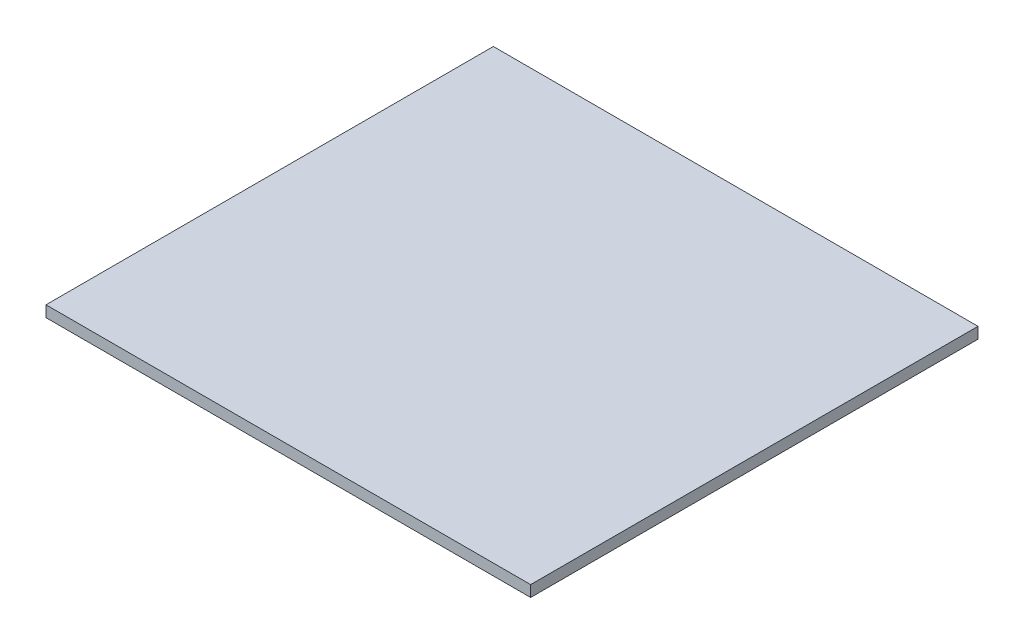
ISO-10303-21;
HEADER;
FILE_DESCRIPTION(('STEP AP214'),'2;1');
FILE_NAME('part.step','',(''),(''),'','','');
FILE_SCHEMA(('AUTOMOTIVE_DESIGN { 1 0 10303 214 1 1 1 1 }'));
ENDSEC;
DATA;
#1=APPLICATION_CONTEXT('core data for automotive mechanical design processes');
#2=APPLICATION_PROTOCOL_DEFINITION('international standard','automotive_design',2000,#1);
#3=PRODUCT_CONTEXT('',#1,'mechanical');
#4=PRODUCT('Part','Part','',(#3));
#5=PRODUCT_RELATED_PRODUCT_CATEGORY('part','',(#4));
#6=PRODUCT_DEFINITION_FORMATION('','',#4);
#7=PRODUCT_DEFINITION_CONTEXT('part definition',#1,'design');
#8=PRODUCT_DEFINITION('design','',#6,#7);
#9=PRODUCT_DEFINITION_SHAPE('','',#8);
#10=(LENGTH_UNIT() NAMED_UNIT(*) SI_UNIT(.MILLI.,.METRE.));
#11=(NAMED_UNIT(*) PLANE_ANGLE_UNIT() SI_UNIT($,.RADIAN.));
#12=(NAMED_UNIT(*) SI_UNIT($,.STERADIAN.) SOLID_ANGLE_UNIT());
#13=UNCERTAINTY_MEASURE_WITH_UNIT(LENGTH_MEASURE(1.E-05),#10,'distance_accuracy_value','');
#14=(GEOMETRIC_REPRESENTATION_CONTEXT(3) GLOBAL_UNCERTAINTY_ASSIGNED_CONTEXT((#13)) GLOBAL_UNIT_ASSIGNED_CONTEXT((#10,
#11,#12)) REPRESENTATION_CONTEXT('',''));
#15=CARTESIAN_POINT('',(0.,0.,0.));
#16=DIRECTION('',(0.,0.,1.));
#17=DIRECTION('',(1.,0.,0.));
#18=AXIS2_PLACEMENT_3D('',#15,#16,#17);
#19=CARTESIAN_POINT('',(-130.,3.,-120.));
#20=DIRECTION('',(1.,0.,0.));
#21=DIRECTION('',(0.,0.,-1.));
#22=AXIS2_PLACEMENT_3D('',#19,#20,#21);
#23=PLANE('',#22);
#24=DIRECTION('',(0.,0.,1.));
#25=VECTOR('',#24,1.);
#26=CARTESIAN_POINT('',(-130.,0.,-120.));
#27=LINE('',#26,#25);
#28=CARTESIAN_POINT('',(-130.,0.,-120.));
#29=VERTEX_POINT('',#28);
#30=CARTESIAN_POINT('',(-130.,0.,0.));
#31=VERTEX_POINT('',#30);
#32=EDGE_CURVE('E93',#29,#31,#27,.T.);
#33=ORIENTED_EDGE('',*,*,#32,.T.);
#34=DIRECTION('',(0.,-1.,0.));
#35=VECTOR('',#34,1.);
#36=CARTESIAN_POINT('',(-130.,3.,0.));
#37=LINE('',#36,#35);
#38=CARTESIAN_POINT('',(-130.,3.,0.));
#39=VERTEX_POINT('',#38);
#40=EDGE_CURVE('E11',#39,#31,#37,.T.);
#41=ORIENTED_EDGE('',*,*,#40,.F.);
#42=DIRECTION('',(0.,0.,1.));
#43=VECTOR('',#42,1.);
#44=CARTESIAN_POINT('',(-130.,3.,-120.));
#45=LINE('',#44,#43);
#46=CARTESIAN_POINT('',(-130.,3.,-120.));
#47=VERTEX_POINT('',#46);
#48=EDGE_CURVE('E81',#47,#39,#45,.T.);
#49=ORIENTED_EDGE('',*,*,#48,.F.);
#50=DIRECTION('',(0.,-1.,0.));
#51=VECTOR('',#50,1.);
#52=CARTESIAN_POINT('',(-130.,3.,-120.));
#53=LINE('',#52,#51);
#54=EDGE_CURVE('E89',#47,#29,#53,.T.);
#55=ORIENTED_EDGE('',*,*,#54,.T.);
#56=EDGE_LOOP('',(#33,#41,#49,#55));
#57=FACE_BOUND('',#56,.T.);
#58=ADVANCED_FACE('F30',(#57),#23,.F.);
#59=CARTESIAN_POINT('',(-130.,3.,0.));
#60=DIRECTION('',(0.,0.,-1.));
#61=DIRECTION('',(-1.,0.,0.));
#62=AXIS2_PLACEMENT_3D('',#59,#60,#61);
#63=PLANE('',#62);
#64=DIRECTION('',(1.,0.,0.));
#65=VECTOR('',#64,1.);
#66=CARTESIAN_POINT('',(-130.,0.,0.));
#67=LINE('',#66,#65);
#68=CARTESIAN_POINT('',(0.,0.,0.));
#69=VERTEX_POINT('',#68);
#70=EDGE_CURVE('E85',#31,#69,#67,.T.);
#71=ORIENTED_EDGE('',*,*,#70,.T.);
#72=DIRECTION('',(0.,-1.,0.));
#73=VECTOR('',#72,1.);
#74=CARTESIAN_POINT('',(0.,3.,0.));
#75=LINE('',#74,#73);
#76=CARTESIAN_POINT('',(0.,3.,0.));
#77=VERTEX_POINT('',#76);
#78=EDGE_CURVE('E38',#77,#69,#75,.T.);
#79=ORIENTED_EDGE('',*,*,#78,.F.);
#80=DIRECTION('',(1.,0.,0.));
#81=VECTOR('',#80,1.);
#82=CARTESIAN_POINT('',(-130.,3.,0.));
#83=LINE('',#82,#81);
#84=EDGE_CURVE('E76',#39,#77,#83,.T.);
#85=ORIENTED_EDGE('',*,*,#84,.F.);
#86=ORIENTED_EDGE('',*,*,#40,.T.);
#87=EDGE_LOOP('',(#71,#79,#85,#86));
#88=FACE_BOUND('',#87,.T.);
#89=ADVANCED_FACE('F84',(#88),#63,.F.);
#90=CARTESIAN_POINT('',(0.,3.,-120.));
#91=DIRECTION('',(-1.,0.,0.));
#92=DIRECTION('',(0.,0.,1.));
#93=AXIS2_PLACEMENT_3D('',#90,#91,#92);
#94=PLANE('',#93);
#95=DIRECTION('',(0.,0.,-1.));
#96=VECTOR('',#95,1.);
#97=CARTESIAN_POINT('',(0.,0.,-120.));
#98=LINE('',#97,#96);
#99=CARTESIAN_POINT('',(0.,0.,-120.));
#100=VERTEX_POINT('',#99);
#101=EDGE_CURVE('E63',#69,#100,#98,.T.);
#102=ORIENTED_EDGE('',*,*,#101,.T.);
#103=DIRECTION('',(0.,-1.,0.));
#104=VECTOR('',#103,1.);
#105=CARTESIAN_POINT('',(0.,3.,-120.));
#106=LINE('',#105,#104);
#107=CARTESIAN_POINT('',(0.,3.,-120.));
#108=VERTEX_POINT('',#107);
#109=EDGE_CURVE('E86',#108,#100,#106,.T.);
#110=ORIENTED_EDGE('',*,*,#109,.F.);
#111=DIRECTION('',(0.,0.,-1.));
#112=VECTOR('',#111,1.);
#113=CARTESIAN_POINT('',(0.,3.,-120.));
#114=LINE('',#113,#112);
#115=EDGE_CURVE('E79',#77,#108,#114,.T.);
#116=ORIENTED_EDGE('',*,*,#115,.F.);
#117=ORIENTED_EDGE('',*,*,#78,.T.);
#118=EDGE_LOOP('',(#102,#110,#116,#117));
#119=FACE_BOUND('',#118,.T.);
#120=ADVANCED_FACE('F87',(#119),#94,.F.);
#121=CARTESIAN_POINT('',(-130.,3.,-120.));
#122=DIRECTION('',(0.,0.,1.));
#123=DIRECTION('',(1.,0.,0.));
#124=AXIS2_PLACEMENT_3D('',#121,#122,#123);
#125=PLANE('',#124);
#126=DIRECTION('',(-1.,0.,0.));
#127=VECTOR('',#126,1.);
#128=CARTESIAN_POINT('',(-130.,0.,-120.));
#129=LINE('',#128,#127);
#130=EDGE_CURVE('E69',#100,#29,#129,.T.);
#131=ORIENTED_EDGE('',*,*,#130,.T.);
#132=ORIENTED_EDGE('',*,*,#54,.F.);
#133=DIRECTION('',(-1.,0.,0.));
#134=VECTOR('',#133,1.);
#135=CARTESIAN_POINT('',(-130.,3.,-120.));
#136=LINE('',#135,#134);
#137=EDGE_CURVE('E46',#108,#47,#136,.T.);
#138=ORIENTED_EDGE('',*,*,#137,.F.);
#139=ORIENTED_EDGE('',*,*,#109,.T.);
#140=EDGE_LOOP('',(#131,#132,#138,#139));
#141=FACE_BOUND('',#140,.T.);
#142=ADVANCED_FACE('F100',(#141),#125,.F.);
#143=CARTESIAN_POINT('',(-130.,3.,0.));
#144=DIRECTION('',(0.,1.,0.));
#145=DIRECTION('',(0.,0.,1.));
#146=AXIS2_PLACEMENT_3D('',#143,#144,#145);
#147=PLANE('',#146);
#148=ORIENTED_EDGE('',*,*,#48,.T.);
#149=ORIENTED_EDGE('',*,*,#84,.T.);
#150=ORIENTED_EDGE('',*,*,#115,.T.);
#151=ORIENTED_EDGE('',*,*,#137,.T.);
#152=EDGE_LOOP('',(#148,#149,#150,#151));
#153=FACE_BOUND('',#152,.T.);
#154=ADVANCED_FACE('F77',(#153),#147,.T.);
#155=CARTESIAN_POINT('',(-130.,0.,0.));
#156=DIRECTION('',(0.,1.,0.));
#157=DIRECTION('',(0.,0.,1.));
#158=AXIS2_PLACEMENT_3D('',#155,#156,#157);
#159=PLANE('',#158);
#160=ORIENTED_EDGE('',*,*,#32,.F.);
#161=ORIENTED_EDGE('',*,*,#130,.F.);
#162=ORIENTED_EDGE('',*,*,#101,.F.);
#163=ORIENTED_EDGE('',*,*,#70,.F.);
#164=EDGE_LOOP('',(#160,#161,#162,#163));
#165=FACE_BOUND('',#164,.T.);
#166=ADVANCED_FACE('F103',(#165),#159,.F.);
#167=CLOSED_SHELL('',(#58,#89,#120,#142,#154,#166));
#168=MANIFOLD_SOLID_BREP('B2',#167);
#169=ADVANCED_BREP_SHAPE_REPRESENTATION('',(#18,#168),#14);
#170=SHAPE_DEFINITION_REPRESENTATION(#9,#169);
ENDSEC;
END-ISO-10303-21;
